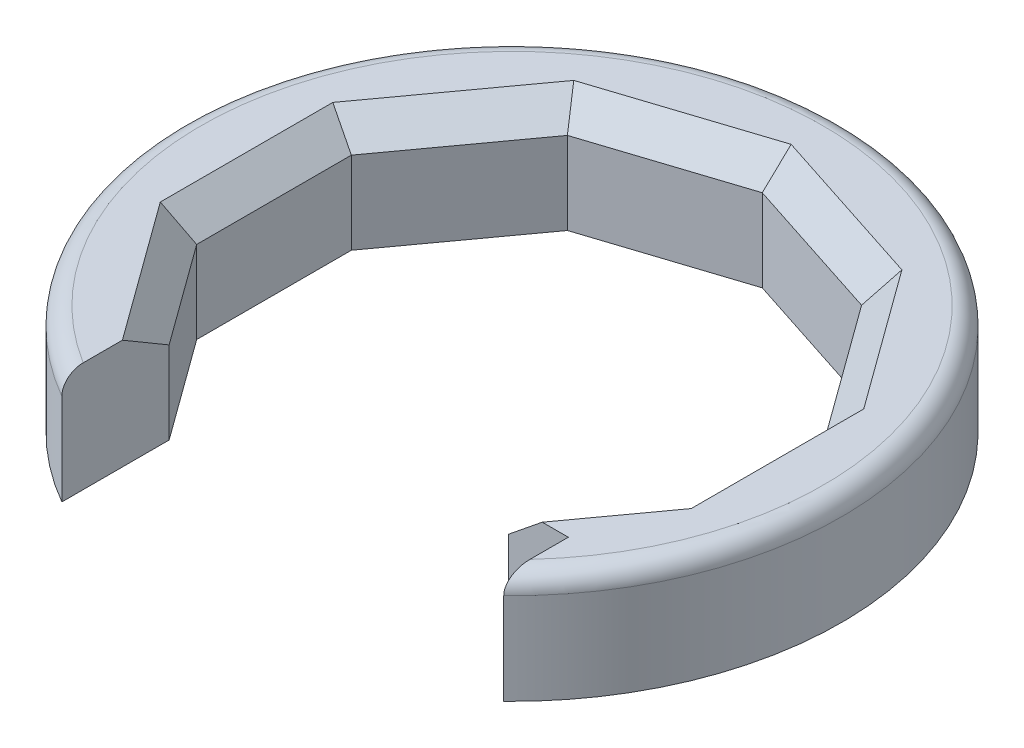
ISO-10303-21;
HEADER;
FILE_DESCRIPTION(('STEP AP214'),'2;1');
FILE_NAME('part.step','',(''),(''),'','','');
FILE_SCHEMA(('AUTOMOTIVE_DESIGN { 1 0 10303 214 1 1 1 1 }'));
ENDSEC;
DATA;
#1=APPLICATION_CONTEXT('core data for automotive mechanical design processes');
#2=APPLICATION_PROTOCOL_DEFINITION('international standard','automotive_design',2000,#1);
#3=PRODUCT_CONTEXT('',#1,'mechanical');
#4=PRODUCT('Part','Part','',(#3));
#5=PRODUCT_RELATED_PRODUCT_CATEGORY('part','',(#4));
#6=PRODUCT_DEFINITION_FORMATION('','',#4);
#7=PRODUCT_DEFINITION_CONTEXT('part definition',#1,'design');
#8=PRODUCT_DEFINITION('design','',#6,#7);
#9=PRODUCT_DEFINITION_SHAPE('','',#8);
#10=(LENGTH_UNIT() NAMED_UNIT(*) SI_UNIT(.MILLI.,.METRE.));
#11=(NAMED_UNIT(*) PLANE_ANGLE_UNIT() SI_UNIT($,.RADIAN.));
#12=(NAMED_UNIT(*) SI_UNIT($,.STERADIAN.) SOLID_ANGLE_UNIT());
#13=UNCERTAINTY_MEASURE_WITH_UNIT(LENGTH_MEASURE(1.E-05),#10,'distance_accuracy_value','');
#14=(GEOMETRIC_REPRESENTATION_CONTEXT(3) GLOBAL_UNCERTAINTY_ASSIGNED_CONTEXT((#13)) GLOBAL_UNIT_ASSIGNED_CONTEXT((#10,
#11,#12)) REPRESENTATION_CONTEXT('',''));
#15=CARTESIAN_POINT('',(0.,0.,0.));
#16=DIRECTION('',(0.,0.,1.));
#17=DIRECTION('',(1.,0.,0.));
#18=AXIS2_PLACEMENT_3D('',#15,#16,#17);
#19=CARTESIAN_POINT('',(0.,12.,0.));
#20=DIRECTION('',(0.,1.,0.));
#21=DIRECTION('',(0.,0.,1.));
#22=AXIS2_PLACEMENT_3D('',#19,#20,#21);
#23=PLANE('',#22);
#24=CARTESIAN_POINT('',(0.,12.,0.));
#25=DIRECTION('',(0.,1.,0.));
#26=DIRECTION('',(0.,0.,1.));
#27=AXIS2_PLACEMENT_3D('',#24,#25,#26);
#28=CIRCLE('',#27,34.);
#29=CARTESIAN_POINT('',(25.,12.,23.0434372436058));
#30=VERTEX_POINT('',#29);
#31=CARTESIAN_POINT('',(-18.,12.,28.8444102037119));
#32=VERTEX_POINT('',#31);
#33=EDGE_CURVE('E285',#30,#32,#28,.T.);
#34=ORIENTED_EDGE('',*,*,#33,.T.);
#35=DIRECTION('',(0.,0.,1.));
#36=VECTOR('',#35,1.);
#37=CARTESIAN_POINT('',(-18.,12.,61.848482003664));
#38=LINE('',#37,#36);
#39=CARTESIAN_POINT('',(-18.,12.,24.5628723159372));
#40=VERTEX_POINT('',#39);
#41=EDGE_CURVE('E182',#40,#32,#38,.T.);
#42=ORIENTED_EDGE('',*,*,#41,.F.);
#43=DIRECTION('',(-0.587785252292474,0.,-0.809016994374947));
#44=VECTOR('',#43,1.);
#45=CARTESIAN_POINT('',(-23.4614928368735,12.,17.0457723164817));
#46=LINE('',#45,#44);
#47=CARTESIAN_POINT('',(-29.,12.,9.4226711907543));
#48=VERTEX_POINT('',#47);
#49=EDGE_CURVE('E284',#40,#48,#46,.T.);
#50=ORIENTED_EDGE('',*,*,#49,.T.);
#51=DIRECTION('',(0.,0.,-1.));
#52=VECTOR('',#51,1.);
#53=CARTESIAN_POINT('',(-29.,12.,0.));
#54=LINE('',#53,#52);
#55=CARTESIAN_POINT('',(-29.,12.,-9.42267119075427));
#56=VERTEX_POINT('',#55);
#57=EDGE_CURVE('E289',#48,#56,#54,.T.);
#58=ORIENTED_EDGE('',*,*,#57,.T.);
#59=DIRECTION('',(0.587785252292473,0.,-0.809016994374948));
#60=VECTOR('',#59,1.);
#61=CARTESIAN_POINT('',(-23.4614928368735,12.,-17.0457723164817));
#62=LINE('',#61,#60);
#63=CARTESIAN_POINT('',(-17.922985673747,12.,-24.6688734422092));
#64=VERTEX_POINT('',#63);
#65=EDGE_CURVE('E296',#56,#64,#62,.T.);
#66=ORIENTED_EDGE('',*,*,#65,.T.);
#67=DIRECTION('',(0.951056516295154,0.,-0.309016994374948));
#68=VECTOR('',#67,1.);
#69=CARTESIAN_POINT('',(-8.96149283687349,12.,-27.5806389725595));
#70=LINE('',#69,#68);
#71=CARTESIAN_POINT('',(0.,12.,-30.4924045029098));
#72=VERTEX_POINT('',#71);
#73=EDGE_CURVE('E299',#64,#72,#70,.T.);
#74=ORIENTED_EDGE('',*,*,#73,.T.);
#75=DIRECTION('',(0.951056516295154,0.,0.309016994374947));
#76=VECTOR('',#75,1.);
#77=CARTESIAN_POINT('',(8.96149283687348,12.,-27.5806389725595));
#78=LINE('',#77,#76);
#79=CARTESIAN_POINT('',(17.922985673747,12.,-24.6688734422092));
#80=VERTEX_POINT('',#79);
#81=EDGE_CURVE('E302',#72,#80,#78,.T.);
#82=ORIENTED_EDGE('',*,*,#81,.T.);
#83=DIRECTION('',(0.587785252292473,0.,0.809016994374947));
#84=VECTOR('',#83,1.);
#85=CARTESIAN_POINT('',(23.4614928368735,12.,-17.0457723164817));
#86=LINE('',#85,#84);
#87=CARTESIAN_POINT('',(29.,12.,-9.4226711907543));
#88=VERTEX_POINT('',#87);
#89=EDGE_CURVE('E305',#80,#88,#86,.T.);
#90=ORIENTED_EDGE('',*,*,#89,.T.);
#91=DIRECTION('',(0.,0.,1.));
#92=VECTOR('',#91,1.);
#93=CARTESIAN_POINT('',(29.,12.,0.));
#94=LINE('',#93,#92);
#95=CARTESIAN_POINT('',(29.,12.,9.42267119075429));
#96=VERTEX_POINT('',#95);
#97=EDGE_CURVE('E308',#88,#96,#94,.T.);
#98=ORIENTED_EDGE('',*,*,#97,.T.);
#99=DIRECTION('',(-0.587785252292473,0.,0.809016994374948));
#100=VECTOR('',#99,1.);
#101=CARTESIAN_POINT('',(23.4614928368735,12.,17.0457723164817));
#102=LINE('',#101,#100);
#103=CARTESIAN_POINT('',(22.1517475834883,12.,18.848482003664));
#104=VERTEX_POINT('',#103);
#105=EDGE_CURVE('E192',#96,#104,#102,.T.);
#106=ORIENTED_EDGE('',*,*,#105,.T.);
#107=DIRECTION('',(-1.,0.,0.));
#108=VECTOR('',#107,1.);
#109=CARTESIAN_POINT('',(25.,12.,18.848482003664));
#110=LINE('',#109,#108);
#111=CARTESIAN_POINT('',(25.,12.,18.848482003664));
#112=VERTEX_POINT('',#111);
#113=EDGE_CURVE('E67',#112,#104,#110,.T.);
#114=ORIENTED_EDGE('',*,*,#113,.F.);
#115=DIRECTION('',(0.,0.,-1.));
#116=VECTOR('',#115,1.);
#117=CARTESIAN_POINT('',(25.,12.,61.848482003664));
#118=LINE('',#117,#116);
#119=EDGE_CURVE('E174',#30,#112,#118,.T.);
#120=ORIENTED_EDGE('',*,*,#119,.F.);
#121=EDGE_LOOP('',(#34,#42,#50,#58,#66,#74,#82,#90,#98,#106,#114,#120));
#122=FACE_BOUND('',#121,.T.);
#123=ADVANCED_FACE('F45',(#122),#23,.T.);
#124=CARTESIAN_POINT('',(0.,0.,0.));
#125=DIRECTION('',(0.,1.,0.));
#126=DIRECTION('',(0.,0.,1.));
#127=AXIS2_PLACEMENT_3D('',#124,#125,#126);
#128=PLANE('',#127);
#129=DIRECTION('',(0.,0.,1.));
#130=VECTOR('',#129,1.);
#131=CARTESIAN_POINT('',(-18.,0.,61.848482003664));
#132=LINE('',#131,#130);
#133=CARTESIAN_POINT('',(-18.,0.,19.458967465825));
#134=VERTEX_POINT('',#133);
#135=CARTESIAN_POINT('',(-18.,0.,31.1769145362398));
#136=VERTEX_POINT('',#135);
#137=EDGE_CURVE('E197',#134,#136,#132,.T.);
#138=ORIENTED_EDGE('',*,*,#137,.T.);
#139=CARTESIAN_POINT('',(0.,0.,0.));
#140=DIRECTION('',(0.,1.,0.));
#141=DIRECTION('',(0.,0.,1.));
#142=AXIS2_PLACEMENT_3D('',#139,#140,#141);
#143=CIRCLE('',#142,36.);
#144=CARTESIAN_POINT('',(25.,0.,25.9036676939772));
#145=VERTEX_POINT('',#144);
#146=EDGE_CURVE('E279',#145,#136,#143,.T.);
#147=ORIENTED_EDGE('',*,*,#146,.F.);
#148=DIRECTION('',(0.,0.,-1.));
#149=VECTOR('',#148,1.);
#150=CARTESIAN_POINT('',(25.,0.,61.848482003664));
#151=LINE('',#150,#149);
#152=CARTESIAN_POINT('',(25.,0.,18.848482003664));
#153=VERTEX_POINT('',#152);
#154=EDGE_CURVE('E201',#145,#153,#151,.T.);
#155=ORIENTED_EDGE('',*,*,#154,.T.);
#156=DIRECTION('',(-1.,0.,0.));
#157=VECTOR('',#156,1.);
#158=CARTESIAN_POINT('',(25.,0.,18.848482003664));
#159=LINE('',#158,#157);
#160=CARTESIAN_POINT('',(18.4435436509889,0.,18.848482003664));
#161=VERTEX_POINT('',#160);
#162=EDGE_CURVE('E186',#153,#161,#159,.T.);
#163=ORIENTED_EDGE('',*,*,#162,.T.);
#164=DIRECTION('',(0.587785252292473,0.,-0.809016994374948));
#165=VECTOR('',#164,1.);
#166=CARTESIAN_POINT('',(16.0688837074973,0.,22.116921017153));
#167=LINE('',#166,#165);
#168=CARTESIAN_POINT('',(26.,0.,8.44791210205556));
#169=VERTEX_POINT('',#168);
#170=EDGE_CURVE('E378',#161,#169,#167,.T.);
#171=ORIENTED_EDGE('',*,*,#170,.T.);
#172=DIRECTION('',(0.,0.,-1.));
#173=VECTOR('',#172,1.);
#174=CARTESIAN_POINT('',(26.,0.,8.44791210205556));
#175=LINE('',#174,#173);
#176=CARTESIAN_POINT('',(26.,0.,-8.44791210205557));
#177=VERTEX_POINT('',#176);
#178=EDGE_CURVE('E408',#169,#177,#175,.T.);
#179=ORIENTED_EDGE('',*,*,#178,.T.);
#180=DIRECTION('',(-0.587785252292473,0.,-0.809016994374947));
#181=VECTOR('',#180,1.);
#182=CARTESIAN_POINT('',(26.,0.,-8.44791210205557));
#183=LINE('',#182,#181);
#184=CARTESIAN_POINT('',(16.0688837074973,0.,-22.1169210171531));
#185=VERTEX_POINT('',#184);
#186=EDGE_CURVE('E368',#177,#185,#183,.T.);
#187=ORIENTED_EDGE('',*,*,#186,.T.);
#188=DIRECTION('',(-0.951056516295154,0.,-0.309016994374947));
#189=VECTOR('',#188,1.);
#190=CARTESIAN_POINT('',(16.0688837074973,0.,-22.1169210171531));
#191=LINE('',#190,#189);
#192=CARTESIAN_POINT('',(0.,0.,-27.338017830195));
#193=VERTEX_POINT('',#192);
#194=EDGE_CURVE('E386',#185,#193,#191,.T.);
#195=ORIENTED_EDGE('',*,*,#194,.T.);
#196=DIRECTION('',(-0.951056516295153,0.,0.309016994374948));
#197=VECTOR('',#196,1.);
#198=CARTESIAN_POINT('',(0.,0.,-27.338017830195));
#199=LINE('',#198,#197);
#200=CARTESIAN_POINT('',(-16.0688837074973,0.,-22.116921017153));
#201=VERTEX_POINT('',#200);
#202=EDGE_CURVE('E390',#193,#201,#199,.T.);
#203=ORIENTED_EDGE('',*,*,#202,.T.);
#204=DIRECTION('',(-0.587785252292473,0.,0.809016994374948));
#205=VECTOR('',#204,1.);
#206=CARTESIAN_POINT('',(-16.0688837074973,0.,-22.116921017153));
#207=LINE('',#206,#205);
#208=CARTESIAN_POINT('',(-26.,0.,-8.44791210205556));
#209=VERTEX_POINT('',#208);
#210=EDGE_CURVE('E394',#201,#209,#207,.T.);
#211=ORIENTED_EDGE('',*,*,#210,.T.);
#212=DIRECTION('',(0.,0.,1.));
#213=VECTOR('',#212,1.);
#214=CARTESIAN_POINT('',(-26.,0.,-8.44791210205556));
#215=LINE('',#214,#213);
#216=CARTESIAN_POINT('',(-26.,0.,8.44791210205556));
#217=VERTEX_POINT('',#216);
#218=EDGE_CURVE('E398',#209,#217,#215,.T.);
#219=ORIENTED_EDGE('',*,*,#218,.T.);
#220=DIRECTION('',(0.587785252292474,0.,0.809016994374947));
#221=VECTOR('',#220,1.);
#222=CARTESIAN_POINT('',(-26.,0.,8.44791210205556));
#223=LINE('',#222,#221);
#224=EDGE_CURVE('E402',#217,#134,#223,.T.);
#225=ORIENTED_EDGE('',*,*,#224,.T.);
#226=EDGE_LOOP('',(#138,#147,#155,#163,#171,#179,#187,#195,#203,#211,#219,#225));
#227=FACE_BOUND('',#226,.T.);
#228=ADVANCED_FACE('F265',(#227),#128,.F.);
#229=CARTESIAN_POINT('',(0.,12.,0.));
#230=DIRECTION('',(0.,-1.,0.));
#231=DIRECTION('',(0.,0.,-1.));
#232=AXIS2_PLACEMENT_3D('',#229,#230,#231);
#233=CYLINDRICAL_SURFACE('',#232,36.);
#234=DIRECTION('',(0.,-1.,0.));
#235=VECTOR('',#234,1.);
#236=CARTESIAN_POINT('',(-18.,12.,31.1769145362398));
#237=LINE('',#236,#235);
#238=CARTESIAN_POINT('',(-18.,10.,31.1769145362398));
#239=VERTEX_POINT('',#238);
#240=EDGE_CURVE('E216',#239,#136,#237,.T.);
#241=ORIENTED_EDGE('',*,*,#240,.F.);
#242=CARTESIAN_POINT('',(0.,10.,0.));
#243=DIRECTION('',(0.,1.,0.));
#244=DIRECTION('',(0.,0.,1.));
#245=AXIS2_PLACEMENT_3D('',#242,#243,#244);
#246=CIRCLE('',#245,36.);
#247=CARTESIAN_POINT('',(25.,10.0000000000021,25.9036676939829));
#248=VERTEX_POINT('',#247);
#249=EDGE_CURVE('E277',#239,#248,#246,.F.);
#250=ORIENTED_EDGE('',*,*,#249,.T.);
#251=DIRECTION('',(0.,-1.,0.));
#252=VECTOR('',#251,1.);
#253=CARTESIAN_POINT('',(25.,12.,25.9036676939772));
#254=LINE('',#253,#252);
#255=EDGE_CURVE('E344',#145,#248,#254,.F.);
#256=ORIENTED_EDGE('',*,*,#255,.F.);
#257=ORIENTED_EDGE('',*,*,#146,.T.);
#258=EDGE_LOOP('',(#241,#250,#256,#257));
#259=FACE_BOUND('',#258,.T.);
#260=ADVANCED_FACE('F241',(#259),#233,.T.);
#261=CARTESIAN_POINT('',(-26.,12.,8.44791210205556));
#262=DIRECTION('',(0.809016994374947,0.,-0.587785252292474));
#263=DIRECTION('',(-0.587785252292474,0.,-0.809016994374947));
#264=AXIS2_PLACEMENT_3D('',#261,#262,#263);
#265=PLANE('',#264);
#266=DIRECTION('',(0.587785252292474,0.,0.809016994374947));
#267=VECTOR('',#266,1.);
#268=CARTESIAN_POINT('',(-26.,9.,8.44791210205556));
#269=LINE('',#268,#267);
#270=CARTESIAN_POINT('',(-26.,9.,8.44791210205556));
#271=VERTEX_POINT('',#270);
#272=CARTESIAN_POINT('',(-18.,9.,19.458967465825));
#273=VERTEX_POINT('',#272);
#274=EDGE_CURVE('E334',#271,#273,#269,.T.);
#275=ORIENTED_EDGE('',*,*,#274,.T.);
#276=DIRECTION('',(0.,-1.,0.));
#277=VECTOR('',#276,1.);
#278=CARTESIAN_POINT('',(-18.,12.,19.458967465825));
#279=LINE('',#278,#277);
#280=EDGE_CURVE('E75',#273,#134,#279,.T.);
#281=ORIENTED_EDGE('',*,*,#280,.T.);
#282=ORIENTED_EDGE('',*,*,#224,.F.);
#283=DIRECTION('',(0.,-1.,0.));
#284=VECTOR('',#283,1.);
#285=CARTESIAN_POINT('',(-26.,12.,8.44791210205556));
#286=LINE('',#285,#284);
#287=EDGE_CURVE('E418',#271,#217,#286,.T.);
#288=ORIENTED_EDGE('',*,*,#287,.F.);
#289=EDGE_LOOP('',(#275,#281,#282,#288));
#290=FACE_BOUND('',#289,.T.);
#291=ADVANCED_FACE('F237',(#290),#265,.T.);
#292=CARTESIAN_POINT('',(16.0688837074973,12.,22.116921017153));
#293=DIRECTION('',(-0.809016994374948,0.,-0.587785252292473));
#294=DIRECTION('',(-0.587785252292473,0.,0.809016994374948));
#295=AXIS2_PLACEMENT_3D('',#292,#293,#294);
#296=PLANE('',#295);
#297=ORIENTED_EDGE('',*,*,#170,.F.);
#298=DIRECTION('',(0.,1.,0.));
#299=VECTOR('',#298,1.);
#300=CARTESIAN_POINT('',(18.4435436509889,12.,18.848482003664));
#301=LINE('',#300,#299);
#302=CARTESIAN_POINT('',(18.4435436509889,9.,18.848482003664));
#303=VERTEX_POINT('',#302);
#304=EDGE_CURVE('E281',#161,#303,#301,.T.);
#305=ORIENTED_EDGE('',*,*,#304,.T.);
#306=DIRECTION('',(0.587785252292473,0.,-0.809016994374948));
#307=VECTOR('',#306,1.);
#308=CARTESIAN_POINT('',(16.0688837074973,9.,22.116921017153));
#309=LINE('',#308,#307);
#310=CARTESIAN_POINT('',(26.,9.,8.44791210205556));
#311=VERTEX_POINT('',#310);
#312=EDGE_CURVE('E313',#303,#311,#309,.T.);
#313=ORIENTED_EDGE('',*,*,#312,.T.);
#314=DIRECTION('',(0.,-1.,0.));
#315=VECTOR('',#314,1.);
#316=CARTESIAN_POINT('',(26.,12.,8.44791210205556));
#317=LINE('',#316,#315);
#318=EDGE_CURVE('E415',#311,#169,#317,.T.);
#319=ORIENTED_EDGE('',*,*,#318,.T.);
#320=EDGE_LOOP('',(#297,#305,#313,#319));
#321=FACE_BOUND('',#320,.T.);
#322=ADVANCED_FACE('F234',(#321),#296,.T.);
#323=CARTESIAN_POINT('',(0.,10.,0.));
#324=DIRECTION('',(0.,1.,0.));
#325=DIRECTION('',(0.,0.,1.));
#326=AXIS2_PLACEMENT_3D('',#323,#324,#325);
#327=TOROIDAL_SURFACE('',#326,34.,2.);
#328=ORIENTED_EDGE('',*,*,#249,.F.);
#329=CARTESIAN_POINT('',(-18.,10.6361330351254,26.5830403153946));
#330=CARTESIAN_POINT('',(-18.,10.5482858258968,26.5474427957275));
#331=CARTESIAN_POINT('',(-18.,10.4575894375436,26.5189070869829));
#332=CARTESIAN_POINT('',(-18.,10.2726898409289,26.4774112686447));
#333=CARTESIAN_POINT('',(-18.,10.1784881422343,26.4644445324852));
#334=CARTESIAN_POINT('',(-18.,9.98912805852227,26.4548310917646));
#335=CARTESIAN_POINT('',(-18.,9.8939685865376,26.4582056820722));
#336=CARTESIAN_POINT('',(-18.,9.70562066922643,26.4811192347313));
#337=CARTESIAN_POINT('',(-18.,9.61243251316382,26.5006605526877));
#338=CARTESIAN_POINT('',(-18.,9.43157712945157,26.5545097909826));
#339=CARTESIAN_POINT('',(-18.,9.34386080170575,26.588654461248));
#340=CARTESIAN_POINT('',(-18.,9.17475660768683,26.6700270696703));
#341=CARTESIAN_POINT('',(-18.,9.09337033423721,26.7172582872255));
#342=CARTESIAN_POINT('',(-18.,8.93145423537435,26.8275508171222));
#343=CARTESIAN_POINT('',(-18.,8.8516254796161,26.891637156659));
#344=CARTESIAN_POINT('',(-18.,8.70206257745867,27.0306344685196));
#345=CARTESIAN_POINT('',(-18.,8.63233344938019,27.1055507853743));
#346=CARTESIAN_POINT('',(-18.,8.49350163569165,27.2763480708842));
#347=CARTESIAN_POINT('',(-18.,8.4261826394879,27.3736775256628));
#348=CARTESIAN_POINT('',(-18.,8.30613647946137,27.5769356467912));
#349=CARTESIAN_POINT('',(-18.,8.25341806950207,27.682869422904));
#350=CARTESIAN_POINT('',(-18.,8.15523526776766,27.9188656173371));
#351=CARTESIAN_POINT('',(-18.,8.11240174416574,28.0500257869947));
#352=CARTESIAN_POINT('',(-18.,8.04685805286448,28.3172899656018));
#353=CARTESIAN_POINT('',(-18.,8.02415901414638,28.4533966654502));
#354=CARTESIAN_POINT('',(-18.,7.99765354361853,28.742867074443));
#355=CARTESIAN_POINT('',(-18.,7.99624715489368,28.8964566133929));
#356=CARTESIAN_POINT('',(-18.,8.01889703660203,29.2018546858649));
#357=CARTESIAN_POINT('',(-18.,8.04296736168965,29.3536621895617));
#358=CARTESIAN_POINT('',(-18.,8.11735178865517,29.6524875684432));
#359=CARTESIAN_POINT('',(-18.,8.16793919134091,29.799438293313));
#360=CARTESIAN_POINT('',(-18.,8.29565258021166,30.0812905187479));
#361=CARTESIAN_POINT('',(-18.,8.37273871151799,30.2162097334482));
#362=CARTESIAN_POINT('',(-18.,8.53072146940021,30.4369622126884));
#363=CARTESIAN_POINT('',(-18.,8.60611920946382,30.5267480731705));
#364=CARTESIAN_POINT('',(-18.,8.77076384585496,30.6926404562973));
#365=CARTESIAN_POINT('',(-18.,8.86000365326258,30.7687539381386));
#366=CARTESIAN_POINT('',(-18.,9.05122344028295,30.9043766265033));
#367=CARTESIAN_POINT('',(-18.,9.15327727646045,30.9637825236961));
#368=CARTESIAN_POINT('',(-18.,9.36684980645237,31.0621002516183));
#369=CARTESIAN_POINT('',(-18.,9.47836249286862,31.1010249786146));
#370=CARTESIAN_POINT('',(-18.,9.69416794469318,31.1528990417584));
#371=CARTESIAN_POINT('',(-18.,9.79788534046361,31.1682548513027));
#372=CARTESIAN_POINT('',(-18.,10.0063720105603,31.1800405264052));
#373=CARTESIAN_POINT('',(-18.,10.111140791055,31.176478896999));
#374=CARTESIAN_POINT('',(-18.,10.3117840700482,31.1514652738049));
#375=CARTESIAN_POINT('',(-18.,10.4078036215039,31.1311522004847));
#376=CARTESIAN_POINT('',(-18.,10.5951946892238,31.0750715657887));
#377=CARTESIAN_POINT('',(-18.,10.6865660855031,31.0393036056955));
#378=CARTESIAN_POINT('',(-18.,10.8647053597569,30.9527770985057));
#379=CARTESIAN_POINT('',(-18.,10.9513014855061,30.9016667795395));
#380=CARTESIAN_POINT('',(-18.,11.1156464074737,30.7868262664478));
#381=CARTESIAN_POINT('',(-18.,11.1933924055448,30.7230920983916));
#382=CARTESIAN_POINT('',(-18.,11.3457750828885,30.5785726129976));
#383=CARTESIAN_POINT('',(-18.,11.4194201182598,30.4967441372214));
#384=CARTESIAN_POINT('',(-18.,11.553858215489,30.3231625901531));
#385=CARTESIAN_POINT('',(-18.,11.6146452755398,30.2314049142119));
#386=CARTESIAN_POINT('',(-18.,11.7302281022817,30.0275790763867));
#387=CARTESIAN_POINT('',(-18.,11.7831290482017,29.9144370053501));
#388=CARTESIAN_POINT('',(-18.,11.8717572884684,29.6816301110697));
#389=CARTESIAN_POINT('',(-18.,11.9074753762467,29.5619618292286));
#390=CARTESIAN_POINT('',(-18.,11.9655365320812,29.3022830883822));
#391=CARTESIAN_POINT('',(-18.,11.9854048357716,29.161716902293));
#392=CARTESIAN_POINT('',(-18.,12.0034081861215,28.8791865790936));
#393=CARTESIAN_POINT('',(-18.,12.0015324944104,28.7372217858556));
#394=CARTESIAN_POINT('',(-18.,11.9751515552424,28.4424657737643));
#395=CARTESIAN_POINT('',(-18.,11.9486239320092,28.2898506921115));
#396=CARTESIAN_POINT('',(-18.,11.8702012896936,27.9911362788575));
#397=CARTESIAN_POINT('',(-18.,11.8182912417464,27.845040863528));
#398=CARTESIAN_POINT('',(-18.,11.6896873967469,27.5652650003298));
#399=CARTESIAN_POINT('',(-18.,11.6131607660599,27.4315084294444));
#400=CARTESIAN_POINT('',(-18.,11.4356776519707,27.1812821533305));
#401=CARTESIAN_POINT('',(-18.,11.334760884824,27.0647848360315));
#402=CARTESIAN_POINT('',(-18.,11.1367870413342,26.8809234239687));
#403=CARTESIAN_POINT('',(-18.,11.0444625421679,26.808455400597));
#404=CARTESIAN_POINT('',(-18.,10.8482306658537,26.6814536784066));
#405=CARTESIAN_POINT('',(-18.,10.7443434329463,26.6268894233906));
#406=CARTESIAN_POINT('',(-18.,10.6361330351254,26.5830403153946));
#407=B_SPLINE_CURVE_WITH_KNOTS('',3,(#329,#330,#331,#332,#333,#334,#335,#336,#337,#338,#339,
#340,#341,#342,#343,#344,#345,#346,#347,#348,#349,#350,#351,#352,#353,#354,#355,#356,#357,#358,
#359,#360,#361,#362,#363,#364,#365,#366,#367,#368,#369,#370,#371,#372,#373,#374,#375,#376,#377,
#378,#379,#380,#381,#382,#383,#384,#385,#386,#387,#388,#389,#390,#391,#392,#393,#394,#395,#396,
#397,#398,#399,#400,#401,#402,#403,#404,#405,#406),.UNSPECIFIED.,.T.,.F.,(4,2,2,2,2,2,2,2,2,2,2,
2,2,2,2,2,2,2,2,2,2,2,2,2,2,2,2,2,2,2,2,2,2,2,2,2,2,2,4),(0.,0.283995859008446,
0.567870798981088,0.852115764303923,1.13640215339363,1.41759033723712,1.69884904872228,
2.00477403268088,2.31085050751295,2.66452475284225,3.01841058875657,3.43066887216209,
3.84315488232188,4.3018278743,4.76075403284007,5.22450595748792,5.68756341523877,
6.0378616705711,6.38798111685037,6.74022013469616,7.09223709389448,7.40512335784903,
7.71786896410083,8.01095096766025,8.30404053283024,8.60444317910122,8.90494054149866,
9.23389430154841,9.56300127245436,9.93621588829311,10.3096302502651,10.7337500197412,
11.1580792516061,11.6206154146804,12.0834257763975,12.5431573801899,13.0021453541083,
13.3525733388394,13.7024001022916),.UNSPECIFIED.);
#408=EDGE_CURVE('E208',#239,#32,#407,.T.);
#409=ORIENTED_EDGE('',*,*,#408,.T.);
#410=ORIENTED_EDGE('',*,*,#33,.F.);
#411=CARTESIAN_POINT('',(25.,10.5295645193234,20.0891424074585));
#412=CARTESIAN_POINT('',(25.,10.6315127259896,20.133841847753));
#413=CARTESIAN_POINT('',(25.,10.7285071056986,20.190236616773));
#414=CARTESIAN_POINT('',(25.,10.9105972761625,20.3200590538917));
#415=CARTESIAN_POINT('',(25.,10.9956187461123,20.393586184479));
#416=CARTESIAN_POINT('',(25.,11.1794535780262,20.5784450655929));
#417=CARTESIAN_POINT('',(25.,11.2736969569723,20.6942795263799));
#418=CARTESIAN_POINT('',(25.,11.4429246229368,20.9389638013135));
#419=CARTESIAN_POINT('',(25.,11.517896444972,21.0678219646035));
#420=CARTESIAN_POINT('',(25.,11.6328549471698,21.2985115916807));
#421=CARTESIAN_POINT('',(25.,11.6768407249261,21.3983957572518));
#422=CARTESIAN_POINT('',(25.,11.756086892952,21.6016090981244));
#423=CARTESIAN_POINT('',(25.,11.7913433739385,21.7049397934818));
#424=CARTESIAN_POINT('',(25.,11.8535221197887,21.9141626122578));
#425=CARTESIAN_POINT('',(25.,11.8804372478514,22.0200568459759));
#426=CARTESIAN_POINT('',(25.,11.9261258246824,22.2336004833637));
#427=CARTESIAN_POINT('',(25.,11.9448961081014,22.3412505525742));
#428=CARTESIAN_POINT('',(25.,11.9899476725795,22.6717344056678));
#429=CARTESIAN_POINT('',(25.,12.0033163198798,22.8964617320246));
#430=CARTESIAN_POINT('',(25.,11.9953058124938,23.3451696516522));
#431=CARTESIAN_POINT('',(25.,11.9739560850573,23.5691507162419));
#432=CARTESIAN_POINT('',(25.,11.9017448015841,23.9662011206859));
#433=CARTESIAN_POINT('',(25.,11.8576400452147,24.140493110673));
#434=CARTESIAN_POINT('',(25.,11.7430125845836,24.4802437965334));
#435=CARTESIAN_POINT('',(25.,11.6725284526511,24.6457149886792));
#436=CARTESIAN_POINT('',(25.,11.5262426540314,24.9167378416724));
#437=CARTESIAN_POINT('',(25.,11.4574760682557,25.026079227572));
#438=CARTESIAN_POINT('',(25.,11.303812468484,25.2328548399734));
#439=CARTESIAN_POINT('',(25.,11.2189379266993,25.3303053479066));
#440=CARTESIAN_POINT('',(25.,11.053715388378,25.4881487048746));
#441=CARTESIAN_POINT('',(25.,10.9766345262751,25.5519483401138));
#442=CARTESIAN_POINT('',(25.,10.8131316389212,25.6662428550816));
#443=CARTESIAN_POINT('',(25.,10.7267207260413,25.7167533213741));
#444=CARTESIAN_POINT('',(25.,10.5595134626773,25.7949674415794));
#445=CARTESIAN_POINT('',(25.,10.4797840945006,25.8249421602378));
#446=CARTESIAN_POINT('',(25.,10.3164096322845,25.8710968328531));
#447=CARTESIAN_POINT('',(25.,10.2327665942581,25.8872839460504));
#448=CARTESIAN_POINT('',(25.,10.0636830721006,25.9047623579255));
#449=CARTESIAN_POINT('',(25.,9.97823823920855,25.9060121403955));
#450=CARTESIAN_POINT('',(25.,9.80847570045168,25.8934146194776));
#451=CARTESIAN_POINT('',(25.,9.72415808940363,25.8795660540736));
#452=CARTESIAN_POINT('',(25.,9.562629359194,25.8386538797784));
#453=CARTESIAN_POINT('',(25.,9.48526850195958,25.8121718276368));
#454=CARTESIAN_POINT('',(25.,9.33548191446728,25.7478065861808));
#455=CARTESIAN_POINT('',(25.,9.26305809105584,25.7099190219364));
#456=CARTESIAN_POINT('',(25.,9.09915846750494,25.6091051953673));
#457=CARTESIAN_POINT('',(25.,9.01020428001137,25.5420748382057));
#458=CARTESIAN_POINT('',(25.,8.84438140885599,25.3944504060776));
#459=CARTESIAN_POINT('',(25.,8.76753565025191,25.3138311862398));
#460=CARTESIAN_POINT('',(25.,8.60036248332422,25.1116480015973));
#461=CARTESIAN_POINT('',(25.,8.51520720431928,24.9858194014442));
#462=CARTESIAN_POINT('',(25.,8.36598124622872,24.7223131131017));
#463=CARTESIAN_POINT('',(25.,8.30194589915231,24.5846160503119));
#464=CARTESIAN_POINT('',(25.,8.17238184030999,24.2476639581159));
#465=CARTESIAN_POINT('',(25.,8.11566801196444,24.0450249272388));
#466=CARTESIAN_POINT('',(25.,8.03531198279312,23.6334223952566));
#467=CARTESIAN_POINT('',(25.,8.01170549372559,23.4244523128073));
#468=CARTESIAN_POINT('',(25.,7.99487804964906,23.000267661787));
#469=CARTESIAN_POINT('',(25.,8.00240733037022,22.7850244908));
#470=CARTESIAN_POINT('',(25.,8.04850882437874,22.3578929639276));
#471=CARTESIAN_POINT('',(25.,8.08708077803173,22.1460045799988));
#472=CARTESIAN_POINT('',(25.,8.18952709267605,21.7554885193742));
#473=CARTESIAN_POINT('',(25.,8.2497852302658,21.5759333178287));
#474=CARTESIAN_POINT('',(25.,8.36006627936517,21.3151900982643));
#475=CARTESIAN_POINT('',(25.,8.40012578511265,21.2297340522029));
#476=CARTESIAN_POINT('',(25.,8.48729042946673,21.0625157912369));
#477=CARTESIAN_POINT('',(25.,8.53439209323274,20.9807517803196));
#478=CARTESIAN_POINT('',(25.,8.64951972893879,20.8011184357011));
#479=CARTESIAN_POINT('',(25.,8.71979153175453,20.7046639491156));
#480=CARTESIAN_POINT('',(25.,8.87342995973184,20.5227583804724));
#481=CARTESIAN_POINT('',(25.,8.95677827166368,20.437292209708));
#482=CARTESIAN_POINT('',(25.,9.1151267054303,20.3013977534002));
#483=CARTESIAN_POINT('',(25.,9.18714443484737,20.2475205355261));
#484=CARTESIAN_POINT('',(25.,9.33884300781074,20.1518664349063));
#485=CARTESIAN_POINT('',(25.,9.41851188251707,20.1100710501922));
#486=CARTESIAN_POINT('',(25.,9.56943938380322,20.0480163769979));
#487=CARTESIAN_POINT('',(25.,9.63965690101047,20.0252433020122));
#488=CARTESIAN_POINT('',(25.,9.78294754687927,19.9918031229209));
#489=CARTESIAN_POINT('',(25.,9.85601925893666,19.9811300903108));
#490=CARTESIAN_POINT('',(25.,10.0031296506425,19.972812495485));
#491=CARTESIAN_POINT('',(25.,10.0771706091209,19.9752080043171));
#492=CARTESIAN_POINT('',(25.,10.2236455043315,19.9929046187219));
#493=CARTESIAN_POINT('',(25.,10.2960805859579,20.0081962052271));
#494=CARTESIAN_POINT('',(25.,10.3944445572497,20.037528050673));
#495=CARTESIAN_POINT('',(25.,10.4219192640022,20.0466958655257));
#496=CARTESIAN_POINT('',(25.,10.4762286882396,20.0666941915453));
#497=CARTESIAN_POINT('',(25.,10.503063967566,20.0775231757938));
#498=CARTESIAN_POINT('',(25.,10.5295645193234,20.0891424074585));
#499=B_SPLINE_CURVE_WITH_KNOTS('',3,(#411,#412,#413,#414,#415,#416,#417,#418,#419,#420,#421,
#422,#423,#424,#425,#426,#427,#428,#429,#430,#431,#432,#433,#434,#435,#436,#437,#438,#439,#440,
#441,#442,#443,#444,#445,#446,#447,#448,#449,#450,#451,#452,#453,#454,#455,#456,#457,#458,#459,
#460,#461,#462,#463,#464,#465,#466,#467,#468,#469,#470,#471,#472,#473,#474,#475,#476,#477,#478,
#479,#480,#481,#482,#483,#484,#485,#486,#487,#488,#489,#490,#491,#492,#493,#494,#495,#496,#497,
#498),.UNSPECIFIED.,.T.,.F.,(4,2,2,2,2,2,2,2,2,2,2,2,2,2,2,2,2,2,2,2,2,2,2,2,2,2,2,2,2,2,2,2,2,
2,2,2,2,2,2,2,2,2,2,4),(0.,0.333811257776216,0.669611003200168,1.11512622983692,
1.56092889795869,1.88794531092411,2.21510790940912,2.54254965793768,2.87011854715881,
3.54271009837692,4.21473185894294,4.75234141106907,5.28916791413431,5.67544087299253,
6.06117885189025,6.36025383304359,6.65897645622364,6.91341051304879,7.16771237382358,
7.42272086698691,7.67775067701845,7.92203206232381,8.16640726881696,8.49871467935485,
8.83164388210388,9.28495364446396,9.73901795714835,10.3669274137304,10.9955136552683,
11.6393332336041,12.2831474272246,12.8492478962318,13.1321116536286,13.4148362942678,
13.7718650672979,14.1283982243594,14.3973100754082,14.66580790974,14.8863265251677,
15.1067370491238,15.3278237797609,15.5487474608713,15.6355981595045,15.7223694996113),.UNSPECIFIED.);
#500=EDGE_CURVE('E11',#30,#248,#499,.T.);
#501=ORIENTED_EDGE('',*,*,#500,.T.);
#502=EDGE_LOOP('',(#328,#409,#410,#501));
#503=FACE_BOUND('',#502,.T.);
#504=ADVANCED_FACE('F218',(#503),#327,.T.);
#505=CARTESIAN_POINT('',(16.0688837074973,9.,22.116921017153));
#506=DIRECTION('',(0.572061402817684,-0.707106781186549,0.415626937777453));
#507=DIRECTION('',(0.587785252292473,0.,-0.809016994374948));
#508=AXIS2_PLACEMENT_3D('',#505,#506,#507);
#509=PLANE('',#508);
#510=ORIENTED_EDGE('',*,*,#312,.F.);
#511=DIRECTION('',(-0.777437524821137,-0.628960169645093,0.));
#512=VECTOR('',#511,1.);
#513=CARTESIAN_POINT('',(17.0082775598638,7.83884534082963,18.848482003664));
#514=LINE('',#513,#512);
#515=EDGE_CURVE('E60',#303,#104,#514,.F.);
#516=ORIENTED_EDGE('',*,*,#515,.T.);
#517=ORIENTED_EDGE('',*,*,#105,.F.);
#518=DIRECTION('',(0.689151757774653,0.689151757774651,0.223918979794513));
#519=VECTOR('',#518,1.);
#520=CARTESIAN_POINT('',(23.3927351053648,6.39273510536478,7.60076038449197));
#521=LINE('',#520,#519);
#522=EDGE_CURVE('E343',#96,#311,#521,.F.);
#523=ORIENTED_EDGE('',*,*,#522,.T.);
#524=EDGE_LOOP('',(#510,#516,#517,#523));
#525=FACE_BOUND('',#524,.T.);
#526=ADVANCED_FACE('F373',(#525),#509,.F.);
#527=CARTESIAN_POINT('',(-26.,9.,8.44791210205556));
#528=DIRECTION('',(-0.572061402817683,-0.707106781186549,0.415626937777453));
#529=DIRECTION('',(0.587785252292474,0.,0.809016994374947));
#530=AXIS2_PLACEMENT_3D('',#527,#528,#529);
#531=PLANE('',#530);
#532=ORIENTED_EDGE('',*,*,#49,.F.);
#533=DIRECTION('',(0.,0.506731853971385,0.862103722396976));
#534=VECTOR('',#533,1.);
#535=CARTESIAN_POINT('',(-18.,4.1897608112198,11.2752997572199));
#536=LINE('',#535,#534);
#537=EDGE_CURVE('E338',#40,#273,#536,.F.);
#538=ORIENTED_EDGE('',*,*,#537,.T.);
#539=ORIENTED_EDGE('',*,*,#274,.F.);
#540=DIRECTION('',(-0.689151757774652,0.68915175777465,0.223918979794516));
#541=VECTOR('',#540,1.);
#542=CARTESIAN_POINT('',(-23.3927351053648,6.39273510536476,7.60076038449195));
#543=LINE('',#542,#541);
#544=EDGE_CURVE('E339',#271,#48,#543,.T.);
#545=ORIENTED_EDGE('',*,*,#544,.T.);
#546=EDGE_LOOP('',(#532,#538,#539,#545));
#547=FACE_BOUND('',#546,.T.);
#548=ADVANCED_FACE('F261',(#547),#531,.F.);
#549=CARTESIAN_POINT('',(26.,12.,-8.44791210205557));
#550=DIRECTION('',(-0.809016994374947,0.,0.587785252292473));
#551=DIRECTION('',(0.587785252292473,0.,0.809016994374947));
#552=AXIS2_PLACEMENT_3D('',#549,#550,#551);
#553=PLANE('',#552);
#554=DIRECTION('',(0.,-1.,0.));
#555=VECTOR('',#554,1.);
#556=CARTESIAN_POINT('',(26.,12.,-8.44791210205557));
#557=LINE('',#556,#555);
#558=CARTESIAN_POINT('',(26.,9.,-8.44791210205557));
#559=VERTEX_POINT('',#558);
#560=EDGE_CURVE('E412',#559,#177,#557,.T.);
#561=ORIENTED_EDGE('',*,*,#560,.F.);
#562=DIRECTION('',(-0.587785252292473,0.,-0.809016994374947));
#563=VECTOR('',#562,1.);
#564=CARTESIAN_POINT('',(26.,9.,-8.44791210205557));
#565=LINE('',#564,#563);
#566=CARTESIAN_POINT('',(16.0688837074973,9.,-22.1169210171531));
#567=VERTEX_POINT('',#566);
#568=EDGE_CURVE('E319',#559,#567,#565,.T.);
#569=ORIENTED_EDGE('',*,*,#568,.T.);
#570=DIRECTION('',(0.,-1.,0.));
#571=VECTOR('',#570,1.);
#572=CARTESIAN_POINT('',(16.0688837074973,12.,-22.1169210171531));
#573=LINE('',#572,#571);
#574=EDGE_CURVE('E430',#567,#185,#573,.T.);
#575=ORIENTED_EDGE('',*,*,#574,.T.);
#576=ORIENTED_EDGE('',*,*,#186,.F.);
#577=EDGE_LOOP('',(#561,#569,#575,#576));
#578=FACE_BOUND('',#577,.T.);
#579=ADVANCED_FACE('F257',(#578),#553,.T.);
#580=CARTESIAN_POINT('',(16.0688837074973,12.,-22.1169210171531));
#581=DIRECTION('',(-0.309016994374947,0.,0.951056516295154));
#582=DIRECTION('',(0.951056516295154,0.,0.309016994374947));
#583=AXIS2_PLACEMENT_3D('',#580,#581,#582);
#584=PLANE('',#583);
#585=ORIENTED_EDGE('',*,*,#574,.F.);
#586=DIRECTION('',(-0.951056516295154,0.,-0.309016994374947));
#587=VECTOR('',#586,1.);
#588=CARTESIAN_POINT('',(16.0688837074973,9.,-22.1169210171531));
#589=LINE('',#588,#587);
#590=CARTESIAN_POINT('',(0.,9.,-27.338017830195));
#591=VERTEX_POINT('',#590);
#592=EDGE_CURVE('E322',#567,#591,#589,.T.);
#593=ORIENTED_EDGE('',*,*,#592,.T.);
#594=DIRECTION('',(0.,-1.,0.));
#595=VECTOR('',#594,1.);
#596=CARTESIAN_POINT('',(0.,12.,-27.338017830195));
#597=LINE('',#596,#595);
#598=EDGE_CURVE('E427',#591,#193,#597,.T.);
#599=ORIENTED_EDGE('',*,*,#598,.T.);
#600=ORIENTED_EDGE('',*,*,#194,.F.);
#601=EDGE_LOOP('',(#585,#593,#599,#600));
#602=FACE_BOUND('',#601,.T.);
#603=ADVANCED_FACE('F253',(#602),#584,.T.);
#604=CARTESIAN_POINT('',(0.,12.,-27.338017830195));
#605=DIRECTION('',(0.309016994374948,0.,0.951056516295154));
#606=DIRECTION('',(0.951056516295154,0.,-0.309016994374948));
#607=AXIS2_PLACEMENT_3D('',#604,#605,#606);
#608=PLANE('',#607);
#609=ORIENTED_EDGE('',*,*,#598,.F.);
#610=DIRECTION('',(-0.951056516295154,0.,0.309016994374948));
#611=VECTOR('',#610,1.);
#612=CARTESIAN_POINT('',(0.,9.,-27.338017830195));
#613=LINE('',#612,#611);
#614=CARTESIAN_POINT('',(-16.0688837074973,9.,-22.116921017153));
#615=VERTEX_POINT('',#614);
#616=EDGE_CURVE('E325',#591,#615,#613,.T.);
#617=ORIENTED_EDGE('',*,*,#616,.T.);
#618=DIRECTION('',(0.,-1.,0.));
#619=VECTOR('',#618,1.);
#620=CARTESIAN_POINT('',(-16.0688837074973,12.,-22.116921017153));
#621=LINE('',#620,#619);
#622=EDGE_CURVE('E424',#615,#201,#621,.T.);
#623=ORIENTED_EDGE('',*,*,#622,.T.);
#624=ORIENTED_EDGE('',*,*,#202,.F.);
#625=EDGE_LOOP('',(#609,#617,#623,#624));
#626=FACE_BOUND('',#625,.T.);
#627=ADVANCED_FACE('F249',(#626),#608,.T.);
#628=CARTESIAN_POINT('',(-16.0688837074973,12.,-22.116921017153));
#629=DIRECTION('',(0.809016994374948,0.,0.587785252292473));
#630=DIRECTION('',(0.587785252292473,0.,-0.809016994374948));
#631=AXIS2_PLACEMENT_3D('',#628,#629,#630);
#632=PLANE('',#631);
#633=ORIENTED_EDGE('',*,*,#622,.F.);
#634=DIRECTION('',(-0.587785252292473,0.,0.809016994374948));
#635=VECTOR('',#634,1.);
#636=CARTESIAN_POINT('',(-16.0688837074973,9.,-22.116921017153));
#637=LINE('',#636,#635);
#638=CARTESIAN_POINT('',(-26.,9.,-8.44791210205556));
#639=VERTEX_POINT('',#638);
#640=EDGE_CURVE('E328',#615,#639,#637,.T.);
#641=ORIENTED_EDGE('',*,*,#640,.T.);
#642=DIRECTION('',(0.,-1.,0.));
#643=VECTOR('',#642,1.);
#644=CARTESIAN_POINT('',(-26.,12.,-8.44791210205556));
#645=LINE('',#644,#643);
#646=EDGE_CURVE('E421',#639,#209,#645,.T.);
#647=ORIENTED_EDGE('',*,*,#646,.T.);
#648=ORIENTED_EDGE('',*,*,#210,.F.);
#649=EDGE_LOOP('',(#633,#641,#647,#648));
#650=FACE_BOUND('',#649,.T.);
#651=ADVANCED_FACE('F245',(#650),#632,.T.);
#652=CARTESIAN_POINT('',(-26.,12.,-8.44791210205556));
#653=DIRECTION('',(1.,0.,0.));
#654=DIRECTION('',(0.,0.,-1.));
#655=AXIS2_PLACEMENT_3D('',#652,#653,#654);
#656=PLANE('',#655);
#657=ORIENTED_EDGE('',*,*,#646,.F.);
#658=DIRECTION('',(0.,0.,1.));
#659=VECTOR('',#658,1.);
#660=CARTESIAN_POINT('',(-26.,9.,-8.44791210205556));
#661=LINE('',#660,#659);
#662=EDGE_CURVE('E331',#639,#271,#661,.T.);
#663=ORIENTED_EDGE('',*,*,#662,.T.);
#664=ORIENTED_EDGE('',*,*,#287,.T.);
#665=ORIENTED_EDGE('',*,*,#218,.F.);
#666=EDGE_LOOP('',(#657,#663,#664,#665));
#667=FACE_BOUND('',#666,.T.);
#668=ADVANCED_FACE('F232',(#667),#656,.T.);
#669=CARTESIAN_POINT('',(26.,12.,8.44791210205556));
#670=DIRECTION('',(-1.,0.,0.));
#671=DIRECTION('',(0.,0.,1.));
#672=AXIS2_PLACEMENT_3D('',#669,#670,#671);
#673=PLANE('',#672);
#674=ORIENTED_EDGE('',*,*,#318,.F.);
#675=DIRECTION('',(0.,0.,-1.));
#676=VECTOR('',#675,1.);
#677=CARTESIAN_POINT('',(26.,9.,8.44791210205556));
#678=LINE('',#677,#676);
#679=EDGE_CURVE('E316',#311,#559,#678,.T.);
#680=ORIENTED_EDGE('',*,*,#679,.T.);
#681=ORIENTED_EDGE('',*,*,#560,.T.);
#682=ORIENTED_EDGE('',*,*,#178,.F.);
#683=EDGE_LOOP('',(#674,#680,#681,#682));
#684=FACE_BOUND('',#683,.T.);
#685=ADVANCED_FACE('F229',(#684),#673,.T.);
#686=CARTESIAN_POINT('',(16.0688837074973,9.,-22.1169210171531));
#687=DIRECTION('',(0.21850801222441,-0.707106781186549,-0.672498511963956));
#688=DIRECTION('',(-0.951056516295154,0.,-0.309016994374947));
#689=AXIS2_PLACEMENT_3D('',#686,#687,#688);
#690=PLANE('',#689);
#691=DIRECTION('',(0.425919209711469,0.68915175777465,-0.586227499828238));
#692=VECTOR('',#691,1.);
#693=CARTESIAN_POINT('',(14.4575053849383,6.39273510536477,-19.8990490269437));
#694=LINE('',#693,#692);
#695=EDGE_CURVE('E360',#80,#567,#694,.F.);
#696=ORIENTED_EDGE('',*,*,#695,.F.);
#697=ORIENTED_EDGE('',*,*,#81,.F.);
#698=DIRECTION('',(0.,0.68915175777465,-0.724617040067448));
#699=VECTOR('',#698,1.);
#700=CARTESIAN_POINT('',(0.,6.39273510536478,-24.5965772849035));
#701=LINE('',#700,#699);
#702=EDGE_CURVE('E364',#591,#72,#701,.T.);
#703=ORIENTED_EDGE('',*,*,#702,.F.);
#704=ORIENTED_EDGE('',*,*,#592,.F.);
#705=EDGE_LOOP('',(#696,#697,#703,#704));
#706=FACE_BOUND('',#705,.T.);
#707=ADVANCED_FACE('F48',(#706),#690,.F.);
#708=CARTESIAN_POINT('',(0.,9.,-27.338017830195));
#709=DIRECTION('',(-0.21850801222441,-0.707106781186549,-0.672498511963956));
#710=DIRECTION('',(-0.951056516295154,0.,0.309016994374948));
#711=AXIS2_PLACEMENT_3D('',#708,#709,#710);
#712=PLANE('',#711);
#713=ORIENTED_EDGE('',*,*,#702,.T.);
#714=ORIENTED_EDGE('',*,*,#73,.F.);
#715=DIRECTION('',(-0.425919209711467,0.689151757774651,-0.586227499828239));
#716=VECTOR('',#715,1.);
#717=CARTESIAN_POINT('',(-14.4575053849383,6.39273510536482,-19.8990490269437));
#718=LINE('',#717,#716);
#719=EDGE_CURVE('E356',#615,#64,#718,.T.);
#720=ORIENTED_EDGE('',*,*,#719,.F.);
#721=ORIENTED_EDGE('',*,*,#616,.F.);
#722=EDGE_LOOP('',(#713,#714,#720,#721));
#723=FACE_BOUND('',#722,.T.);
#724=ADVANCED_FACE('F479',(#723),#712,.F.);
#725=CARTESIAN_POINT('',(26.,9.,-8.44791210205557));
#726=DIRECTION('',(0.572061402817683,-0.707106781186549,-0.415626937777453));
#727=DIRECTION('',(-0.587785252292473,0.,-0.809016994374947));
#728=AXIS2_PLACEMENT_3D('',#725,#726,#727);
#729=PLANE('',#728);
#730=ORIENTED_EDGE('',*,*,#695,.T.);
#731=ORIENTED_EDGE('',*,*,#568,.F.);
#732=DIRECTION('',(0.689151757774653,0.689151757774651,-0.223918979794514));
#733=VECTOR('',#732,1.);
#734=CARTESIAN_POINT('',(23.3927351053648,6.39273510536478,-7.60076038449197));
#735=LINE('',#734,#733);
#736=EDGE_CURVE('E352',#88,#559,#735,.F.);
#737=ORIENTED_EDGE('',*,*,#736,.F.);
#738=ORIENTED_EDGE('',*,*,#89,.F.);
#739=EDGE_LOOP('',(#730,#731,#737,#738));
#740=FACE_BOUND('',#739,.T.);
#741=ADVANCED_FACE('F445',(#740),#729,.F.);
#742=CARTESIAN_POINT('',(-16.0688837074973,9.,-22.116921017153));
#743=DIRECTION('',(-0.572061402817684,-0.707106781186548,-0.415626937777453));
#744=DIRECTION('',(-0.587785252292473,0.,0.809016994374948));
#745=AXIS2_PLACEMENT_3D('',#742,#743,#744);
#746=PLANE('',#745);
#747=ORIENTED_EDGE('',*,*,#719,.T.);
#748=ORIENTED_EDGE('',*,*,#65,.F.);
#749=DIRECTION('',(-0.689151757774653,0.689151757774651,-0.223918979794511));
#750=VECTOR('',#749,1.);
#751=CARTESIAN_POINT('',(-23.3927351053648,6.39273510536476,-7.60076038449197));
#752=LINE('',#751,#750);
#753=EDGE_CURVE('E348',#639,#56,#752,.T.);
#754=ORIENTED_EDGE('',*,*,#753,.F.);
#755=ORIENTED_EDGE('',*,*,#640,.F.);
#756=EDGE_LOOP('',(#747,#748,#754,#755));
#757=FACE_BOUND('',#756,.T.);
#758=ADVANCED_FACE('F477',(#757),#746,.F.);
#759=CARTESIAN_POINT('',(26.,9.,8.44791210205556));
#760=DIRECTION('',(0.707106781186546,-0.707106781186549,0.));
#761=DIRECTION('',(0.,0.,-1.));
#762=AXIS2_PLACEMENT_3D('',#759,#760,#761);
#763=PLANE('',#762);
#764=ORIENTED_EDGE('',*,*,#736,.T.);
#765=ORIENTED_EDGE('',*,*,#679,.F.);
#766=ORIENTED_EDGE('',*,*,#522,.F.);
#767=ORIENTED_EDGE('',*,*,#97,.F.);
#768=EDGE_LOOP('',(#764,#765,#766,#767));
#769=FACE_BOUND('',#768,.T.);
#770=ADVANCED_FACE('F450',(#769),#763,.F.);
#771=CARTESIAN_POINT('',(-26.,9.,-8.44791210205556));
#772=DIRECTION('',(-0.707106781186546,-0.707106781186549,0.));
#773=DIRECTION('',(0.,0.,1.));
#774=AXIS2_PLACEMENT_3D('',#771,#772,#773);
#775=PLANE('',#774);
#776=ORIENTED_EDGE('',*,*,#753,.T.);
#777=ORIENTED_EDGE('',*,*,#57,.F.);
#778=ORIENTED_EDGE('',*,*,#544,.F.);
#779=ORIENTED_EDGE('',*,*,#662,.F.);
#780=EDGE_LOOP('',(#776,#777,#778,#779));
#781=FACE_BOUND('',#780,.T.);
#782=ADVANCED_FACE('F226',(#781),#775,.F.);
#783=CARTESIAN_POINT('',(-18.,12.,61.848482003664));
#784=DIRECTION('',(1.,0.,0.));
#785=DIRECTION('',(0.,0.,-1.));
#786=AXIS2_PLACEMENT_3D('',#783,#784,#785);
#787=PLANE('',#786);
#788=ORIENTED_EDGE('',*,*,#240,.T.);
#789=ORIENTED_EDGE('',*,*,#137,.F.);
#790=ORIENTED_EDGE('',*,*,#280,.F.);
#791=ORIENTED_EDGE('',*,*,#537,.F.);
#792=ORIENTED_EDGE('',*,*,#41,.T.);
#793=ORIENTED_EDGE('',*,*,#408,.F.);
#794=EDGE_LOOP('',(#788,#789,#790,#791,#792,#793));
#795=FACE_BOUND('',#794,.T.);
#796=ADVANCED_FACE('F222',(#795),#787,.T.);
#797=CARTESIAN_POINT('',(25.,12.,61.848482003664));
#798=DIRECTION('',(-1.,0.,0.));
#799=DIRECTION('',(0.,0.,1.));
#800=AXIS2_PLACEMENT_3D('',#797,#798,#799);
#801=PLANE('',#800);
#802=ORIENTED_EDGE('',*,*,#255,.T.);
#803=ORIENTED_EDGE('',*,*,#500,.F.);
#804=ORIENTED_EDGE('',*,*,#119,.T.);
#805=DIRECTION('',(0.,-1.,0.));
#806=VECTOR('',#805,1.);
#807=CARTESIAN_POINT('',(25.,12.,18.848482003664));
#808=LINE('',#807,#806);
#809=EDGE_CURVE('E176',#112,#153,#808,.T.);
#810=ORIENTED_EDGE('',*,*,#809,.T.);
#811=ORIENTED_EDGE('',*,*,#154,.F.);
#812=EDGE_LOOP('',(#802,#803,#804,#810,#811));
#813=FACE_BOUND('',#812,.T.);
#814=ADVANCED_FACE('F175',(#813),#801,.T.);
#815=CARTESIAN_POINT('',(25.,12.,18.848482003664));
#816=DIRECTION('',(0.,0.,1.));
#817=DIRECTION('',(1.,0.,0.));
#818=AXIS2_PLACEMENT_3D('',#815,#816,#817);
#819=PLANE('',#818);
#820=ORIENTED_EDGE('',*,*,#162,.F.);
#821=ORIENTED_EDGE('',*,*,#809,.F.);
#822=ORIENTED_EDGE('',*,*,#113,.T.);
#823=ORIENTED_EDGE('',*,*,#515,.F.);
#824=ORIENTED_EDGE('',*,*,#304,.F.);
#825=EDGE_LOOP('',(#820,#821,#822,#823,#824));
#826=FACE_BOUND('',#825,.T.);
#827=ADVANCED_FACE('F184',(#826),#819,.T.);
#828=CLOSED_SHELL('',(#123,#228,#260,#291,#322,#504,#526,#548,#579,#603,#627,#651,#668,#685,
#707,#724,#741,#758,#770,#782,#796,#814,#827));
#829=MANIFOLD_SOLID_BREP('B2',#828);
#830=ADVANCED_BREP_SHAPE_REPRESENTATION('',(#18,#829),#14);
#831=SHAPE_DEFINITION_REPRESENTATION(#9,#830);
ENDSEC;
END-ISO-10303-21;
